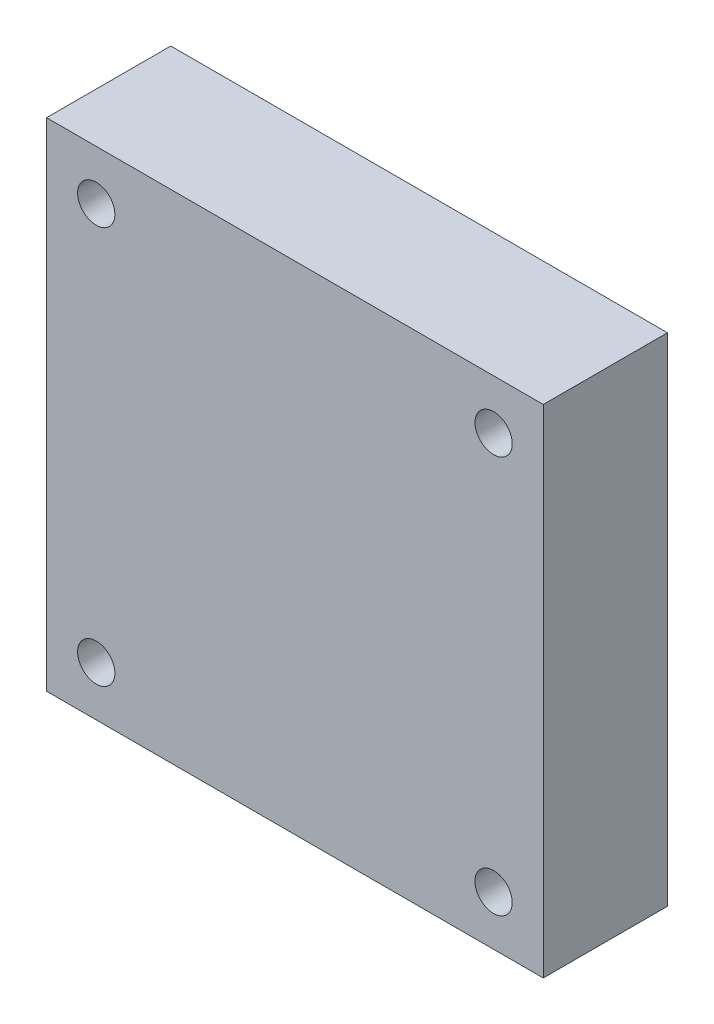
ISO-10303-21;
HEADER;
FILE_DESCRIPTION(('STEP AP214'),'2;1');
FILE_NAME('part.step','',(''),(''),'','','');
FILE_SCHEMA(('AUTOMOTIVE_DESIGN { 1 0 10303 214 1 1 1 1 }'));
ENDSEC;
DATA;
#1=APPLICATION_CONTEXT('core data for automotive mechanical design processes');
#2=APPLICATION_PROTOCOL_DEFINITION('international standard','automotive_design',2000,#1);
#3=PRODUCT_CONTEXT('',#1,'mechanical');
#4=PRODUCT('Part','Part','',(#3));
#5=PRODUCT_RELATED_PRODUCT_CATEGORY('part','',(#4));
#6=PRODUCT_DEFINITION_FORMATION('','',#4);
#7=PRODUCT_DEFINITION_CONTEXT('part definition',#1,'design');
#8=PRODUCT_DEFINITION('design','',#6,#7);
#9=PRODUCT_DEFINITION_SHAPE('','',#8);
#10=(LENGTH_UNIT() NAMED_UNIT(*) SI_UNIT(.MILLI.,.METRE.));
#11=(NAMED_UNIT(*) PLANE_ANGLE_UNIT() SI_UNIT($,.RADIAN.));
#12=(NAMED_UNIT(*) SI_UNIT($,.STERADIAN.) SOLID_ANGLE_UNIT());
#13=UNCERTAINTY_MEASURE_WITH_UNIT(LENGTH_MEASURE(1.E-05),#10,'distance_accuracy_value','');
#14=(GEOMETRIC_REPRESENTATION_CONTEXT(3) GLOBAL_UNCERTAINTY_ASSIGNED_CONTEXT((#13)) GLOBAL_UNIT_ASSIGNED_CONTEXT((#10,
#11,#12)) REPRESENTATION_CONTEXT('',''));
#15=CARTESIAN_POINT('',(0.,0.,0.));
#16=DIRECTION('',(0.,0.,1.));
#17=DIRECTION('',(1.,0.,0.));
#18=AXIS2_PLACEMENT_3D('',#15,#16,#17);
#19=CARTESIAN_POINT('',(0.,0.,10.));
#20=DIRECTION('',(0.,0.,-1.));
#21=DIRECTION('',(-1.,0.,0.));
#22=AXIS2_PLACEMENT_3D('',#19,#20,#21);
#23=PLANE('',#22);
#24=CARTESIAN_POINT('',(16.,-16.,10.));
#25=DIRECTION('',(0.,0.,1.));
#26=DIRECTION('',(1.,0.,0.));
#27=AXIS2_PLACEMENT_3D('',#24,#25,#26);
#28=CIRCLE('',#27,1.5);
#29=CARTESIAN_POINT('',(17.5,-16.,10.));
#30=VERTEX_POINT('',#29);
#31=EDGE_CURVE('E121',#30,#30,#28,.T.);
#32=ORIENTED_EDGE('',*,*,#31,.F.);
#33=EDGE_LOOP('',(#32));
#34=FACE_BOUND('',#33,.T.);
#35=CARTESIAN_POINT('',(-16.,16.,10.));
#36=DIRECTION('',(0.,0.,1.));
#37=DIRECTION('',(1.,0.,0.));
#38=AXIS2_PLACEMENT_3D('',#35,#36,#37);
#39=CIRCLE('',#38,1.5);
#40=CARTESIAN_POINT('',(-14.5,16.,10.));
#41=VERTEX_POINT('',#40);
#42=EDGE_CURVE('E100',#41,#41,#39,.T.);
#43=ORIENTED_EDGE('',*,*,#42,.F.);
#44=EDGE_LOOP('',(#43));
#45=FACE_BOUND('',#44,.T.);
#46=DIRECTION('',(0.,1.,0.));
#47=VECTOR('',#46,1.);
#48=CARTESIAN_POINT('',(20.,-20.,10.));
#49=LINE('',#48,#47);
#50=CARTESIAN_POINT('',(20.,-20.,10.));
#51=VERTEX_POINT('',#50);
#52=CARTESIAN_POINT('',(20.,20.,10.));
#53=VERTEX_POINT('',#52);
#54=EDGE_CURVE('E85',#51,#53,#49,.T.);
#55=ORIENTED_EDGE('',*,*,#54,.T.);
#56=DIRECTION('',(-1.,0.,0.));
#57=VECTOR('',#56,1.);
#58=CARTESIAN_POINT('',(-20.,20.,10.));
#59=LINE('',#58,#57);
#60=CARTESIAN_POINT('',(-20.,20.,10.));
#61=VERTEX_POINT('',#60);
#62=EDGE_CURVE('E80',#53,#61,#59,.T.);
#63=ORIENTED_EDGE('',*,*,#62,.T.);
#64=DIRECTION('',(0.,-1.,0.));
#65=VECTOR('',#64,1.);
#66=CARTESIAN_POINT('',(-20.,-20.,10.));
#67=LINE('',#66,#65);
#68=CARTESIAN_POINT('',(-20.,-20.,10.));
#69=VERTEX_POINT('',#68);
#70=EDGE_CURVE('E83',#61,#69,#67,.T.);
#71=ORIENTED_EDGE('',*,*,#70,.T.);
#72=DIRECTION('',(1.,0.,0.));
#73=VECTOR('',#72,1.);
#74=CARTESIAN_POINT('',(-20.,-20.,10.));
#75=LINE('',#74,#73);
#76=EDGE_CURVE('E50',#69,#51,#75,.T.);
#77=ORIENTED_EDGE('',*,*,#76,.T.);
#78=EDGE_LOOP('',(#55,#63,#71,#77));
#79=FACE_BOUND('',#78,.T.);
#80=CARTESIAN_POINT('',(16.,16.,10.));
#81=DIRECTION('',(0.,0.,1.));
#82=DIRECTION('',(-1.,0.,0.));
#83=AXIS2_PLACEMENT_3D('',#80,#81,#82);
#84=CIRCLE('',#83,1.5);
#85=CARTESIAN_POINT('',(14.5,16.,10.));
#86=VERTEX_POINT('',#85);
#87=EDGE_CURVE('E115',#86,#86,#84,.T.);
#88=ORIENTED_EDGE('',*,*,#87,.F.);
#89=EDGE_LOOP('',(#88));
#90=FACE_BOUND('',#89,.T.);
#91=CARTESIAN_POINT('',(-16.,-16.,10.));
#92=DIRECTION('',(0.,0.,1.));
#93=DIRECTION('',(-1.,0.,0.));
#94=AXIS2_PLACEMENT_3D('',#91,#92,#93);
#95=CIRCLE('',#94,1.5);
#96=CARTESIAN_POINT('',(-17.5,-16.,10.));
#97=VERTEX_POINT('',#96);
#98=EDGE_CURVE('E127',#97,#97,#95,.T.);
#99=ORIENTED_EDGE('',*,*,#98,.F.);
#100=EDGE_LOOP('',(#99));
#101=FACE_BOUND('',#100,.T.);
#102=ADVANCED_FACE('F33',(#34,#45,#79,#90,#101),#23,.F.);
#103=CARTESIAN_POINT('',(0.,0.,0.));
#104=DIRECTION('',(0.,0.,-1.));
#105=DIRECTION('',(-1.,0.,0.));
#106=AXIS2_PLACEMENT_3D('',#103,#104,#105);
#107=PLANE('',#106);
#108=CARTESIAN_POINT('',(16.,-16.,0.));
#109=DIRECTION('',(0.,0.,1.));
#110=DIRECTION('',(1.,0.,0.));
#111=AXIS2_PLACEMENT_3D('',#108,#109,#110);
#112=CIRCLE('',#111,1.5);
#113=CARTESIAN_POINT('',(17.5,-16.,0.));
#114=VERTEX_POINT('',#113);
#115=EDGE_CURVE('E124',#114,#114,#112,.T.);
#116=ORIENTED_EDGE('',*,*,#115,.T.);
#117=EDGE_LOOP('',(#116));
#118=FACE_BOUND('',#117,.T.);
#119=CARTESIAN_POINT('',(-16.,16.,0.));
#120=DIRECTION('',(0.,0.,1.));
#121=DIRECTION('',(1.,0.,0.));
#122=AXIS2_PLACEMENT_3D('',#119,#120,#121);
#123=CIRCLE('',#122,1.5);
#124=CARTESIAN_POINT('',(-14.5,16.,0.));
#125=VERTEX_POINT('',#124);
#126=EDGE_CURVE('E112',#125,#125,#123,.T.);
#127=ORIENTED_EDGE('',*,*,#126,.T.);
#128=EDGE_LOOP('',(#127));
#129=FACE_BOUND('',#128,.T.);
#130=DIRECTION('',(0.,1.,0.));
#131=VECTOR('',#130,1.);
#132=CARTESIAN_POINT('',(20.,-20.,0.));
#133=LINE('',#132,#131);
#134=CARTESIAN_POINT('',(20.,-20.,0.));
#135=VERTEX_POINT('',#134);
#136=CARTESIAN_POINT('',(20.,20.,0.));
#137=VERTEX_POINT('',#136);
#138=EDGE_CURVE('E97',#135,#137,#133,.T.);
#139=ORIENTED_EDGE('',*,*,#138,.F.);
#140=DIRECTION('',(1.,0.,0.));
#141=VECTOR('',#140,1.);
#142=CARTESIAN_POINT('',(-20.,-20.,0.));
#143=LINE('',#142,#141);
#144=CARTESIAN_POINT('',(-20.,-20.,0.));
#145=VERTEX_POINT('',#144);
#146=EDGE_CURVE('E73',#145,#135,#143,.T.);
#147=ORIENTED_EDGE('',*,*,#146,.F.);
#148=DIRECTION('',(0.,-1.,0.));
#149=VECTOR('',#148,1.);
#150=CARTESIAN_POINT('',(-20.,-20.,0.));
#151=LINE('',#150,#149);
#152=CARTESIAN_POINT('',(-20.,20.,0.));
#153=VERTEX_POINT('',#152);
#154=EDGE_CURVE('E67',#153,#145,#151,.T.);
#155=ORIENTED_EDGE('',*,*,#154,.F.);
#156=DIRECTION('',(-1.,0.,0.));
#157=VECTOR('',#156,1.);
#158=CARTESIAN_POINT('',(-20.,20.,0.));
#159=LINE('',#158,#157);
#160=EDGE_CURVE('E89',#137,#153,#159,.T.);
#161=ORIENTED_EDGE('',*,*,#160,.F.);
#162=EDGE_LOOP('',(#139,#147,#155,#161));
#163=FACE_BOUND('',#162,.T.);
#164=CARTESIAN_POINT('',(16.,16.,0.));
#165=DIRECTION('',(0.,0.,1.));
#166=DIRECTION('',(-1.,0.,0.));
#167=AXIS2_PLACEMENT_3D('',#164,#165,#166);
#168=CIRCLE('',#167,1.5);
#169=CARTESIAN_POINT('',(14.5,16.,0.));
#170=VERTEX_POINT('',#169);
#171=EDGE_CURVE('E118',#170,#170,#168,.T.);
#172=ORIENTED_EDGE('',*,*,#171,.T.);
#173=EDGE_LOOP('',(#172));
#174=FACE_BOUND('',#173,.T.);
#175=CARTESIAN_POINT('',(-16.,-16.,0.));
#176=DIRECTION('',(0.,0.,1.));
#177=DIRECTION('',(-1.,0.,0.));
#178=AXIS2_PLACEMENT_3D('',#175,#176,#177);
#179=CIRCLE('',#178,1.5);
#180=CARTESIAN_POINT('',(-17.5,-16.,0.));
#181=VERTEX_POINT('',#180);
#182=EDGE_CURVE('E130',#181,#181,#179,.T.);
#183=ORIENTED_EDGE('',*,*,#182,.T.);
#184=EDGE_LOOP('',(#183));
#185=FACE_BOUND('',#184,.T.);
#186=ADVANCED_FACE('F108',(#118,#129,#163,#174,#185),#107,.T.);
#187=CARTESIAN_POINT('',(20.,-20.,10.));
#188=DIRECTION('',(-1.,0.,0.));
#189=DIRECTION('',(0.,0.,1.));
#190=AXIS2_PLACEMENT_3D('',#187,#188,#189);
#191=PLANE('',#190);
#192=ORIENTED_EDGE('',*,*,#138,.T.);
#193=DIRECTION('',(0.,0.,-1.));
#194=VECTOR('',#193,1.);
#195=CARTESIAN_POINT('',(20.,20.,10.));
#196=LINE('',#195,#194);
#197=EDGE_CURVE('E11',#53,#137,#196,.T.);
#198=ORIENTED_EDGE('',*,*,#197,.F.);
#199=ORIENTED_EDGE('',*,*,#54,.F.);
#200=DIRECTION('',(0.,0.,-1.));
#201=VECTOR('',#200,1.);
#202=CARTESIAN_POINT('',(20.,-20.,10.));
#203=LINE('',#202,#201);
#204=EDGE_CURVE('E93',#51,#135,#203,.T.);
#205=ORIENTED_EDGE('',*,*,#204,.T.);
#206=EDGE_LOOP('',(#192,#198,#199,#205));
#207=FACE_BOUND('',#206,.T.);
#208=ADVANCED_FACE('F35',(#207),#191,.F.);
#209=CARTESIAN_POINT('',(-20.,20.,10.));
#210=DIRECTION('',(0.,-1.,0.));
#211=DIRECTION('',(0.,0.,-1.));
#212=AXIS2_PLACEMENT_3D('',#209,#210,#211);
#213=PLANE('',#212);
#214=ORIENTED_EDGE('',*,*,#160,.T.);
#215=DIRECTION('',(0.,0.,-1.));
#216=VECTOR('',#215,1.);
#217=CARTESIAN_POINT('',(-20.,20.,10.));
#218=LINE('',#217,#216);
#219=EDGE_CURVE('E42',#61,#153,#218,.T.);
#220=ORIENTED_EDGE('',*,*,#219,.F.);
#221=ORIENTED_EDGE('',*,*,#62,.F.);
#222=ORIENTED_EDGE('',*,*,#197,.T.);
#223=EDGE_LOOP('',(#214,#220,#221,#222));
#224=FACE_BOUND('',#223,.T.);
#225=ADVANCED_FACE('F88',(#224),#213,.F.);
#226=CARTESIAN_POINT('',(-20.,-20.,10.));
#227=DIRECTION('',(1.,0.,0.));
#228=DIRECTION('',(0.,0.,-1.));
#229=AXIS2_PLACEMENT_3D('',#226,#227,#228);
#230=PLANE('',#229);
#231=ORIENTED_EDGE('',*,*,#154,.T.);
#232=DIRECTION('',(0.,0.,-1.));
#233=VECTOR('',#232,1.);
#234=CARTESIAN_POINT('',(-20.,-20.,10.));
#235=LINE('',#234,#233);
#236=EDGE_CURVE('E90',#69,#145,#235,.T.);
#237=ORIENTED_EDGE('',*,*,#236,.F.);
#238=ORIENTED_EDGE('',*,*,#70,.F.);
#239=ORIENTED_EDGE('',*,*,#219,.T.);
#240=EDGE_LOOP('',(#231,#237,#238,#239));
#241=FACE_BOUND('',#240,.T.);
#242=ADVANCED_FACE('F91',(#241),#230,.F.);
#243=CARTESIAN_POINT('',(-20.,-20.,10.));
#244=DIRECTION('',(0.,1.,0.));
#245=DIRECTION('',(0.,0.,1.));
#246=AXIS2_PLACEMENT_3D('',#243,#244,#245);
#247=PLANE('',#246);
#248=ORIENTED_EDGE('',*,*,#146,.T.);
#249=ORIENTED_EDGE('',*,*,#204,.F.);
#250=ORIENTED_EDGE('',*,*,#76,.F.);
#251=ORIENTED_EDGE('',*,*,#236,.T.);
#252=EDGE_LOOP('',(#248,#249,#250,#251));
#253=FACE_BOUND('',#252,.T.);
#254=ADVANCED_FACE('F105',(#253),#247,.F.);
#255=CARTESIAN_POINT('',(-16.,16.,10.));
#256=DIRECTION('',(0.,0.,-1.));
#257=DIRECTION('',(-1.,0.,0.));
#258=AXIS2_PLACEMENT_3D('',#255,#256,#257);
#259=CYLINDRICAL_SURFACE('',#258,1.5);
#260=ORIENTED_EDGE('',*,*,#42,.T.);
#261=EDGE_LOOP('',(#260));
#262=FACE_BOUND('',#261,.T.);
#263=ORIENTED_EDGE('',*,*,#126,.F.);
#264=EDGE_LOOP('',(#263));
#265=FACE_BOUND('',#264,.T.);
#266=ADVANCED_FACE('F150',(#262,#265),#259,.F.);
#267=CARTESIAN_POINT('',(16.,16.,10.));
#268=DIRECTION('',(0.,0.,-1.));
#269=DIRECTION('',(-1.,0.,0.));
#270=AXIS2_PLACEMENT_3D('',#267,#268,#269);
#271=CYLINDRICAL_SURFACE('',#270,1.5);
#272=ORIENTED_EDGE('',*,*,#87,.T.);
#273=EDGE_LOOP('',(#272));
#274=FACE_BOUND('',#273,.T.);
#275=ORIENTED_EDGE('',*,*,#171,.F.);
#276=EDGE_LOOP('',(#275));
#277=FACE_BOUND('',#276,.T.);
#278=ADVANCED_FACE('F196',(#274,#277),#271,.F.);
#279=CARTESIAN_POINT('',(16.,-16.,10.));
#280=DIRECTION('',(0.,0.,-1.));
#281=DIRECTION('',(-1.,0.,0.));
#282=AXIS2_PLACEMENT_3D('',#279,#280,#281);
#283=CYLINDRICAL_SURFACE('',#282,1.5);
#284=ORIENTED_EDGE('',*,*,#31,.T.);
#285=EDGE_LOOP('',(#284));
#286=FACE_BOUND('',#285,.T.);
#287=ORIENTED_EDGE('',*,*,#115,.F.);
#288=EDGE_LOOP('',(#287));
#289=FACE_BOUND('',#288,.T.);
#290=ADVANCED_FACE('F204',(#286,#289),#283,.F.);
#291=CARTESIAN_POINT('',(-16.,-16.,10.));
#292=DIRECTION('',(0.,0.,-1.));
#293=DIRECTION('',(-1.,0.,0.));
#294=AXIS2_PLACEMENT_3D('',#291,#292,#293);
#295=CYLINDRICAL_SURFACE('',#294,1.5);
#296=ORIENTED_EDGE('',*,*,#98,.T.);
#297=EDGE_LOOP('',(#296));
#298=FACE_BOUND('',#297,.T.);
#299=ORIENTED_EDGE('',*,*,#182,.F.);
#300=EDGE_LOOP('',(#299));
#301=FACE_BOUND('',#300,.T.);
#302=ADVANCED_FACE('F136',(#298,#301),#295,.F.);
#303=CLOSED_SHELL('',(#102,#186,#208,#225,#242,#254,#266,#278,#290,#302));
#304=MANIFOLD_SOLID_BREP('B2',#303);
#305=ADVANCED_BREP_SHAPE_REPRESENTATION('',(#18,#304),#14);
#306=SHAPE_DEFINITION_REPRESENTATION(#9,#305);
ENDSEC;
END-ISO-10303-21;
